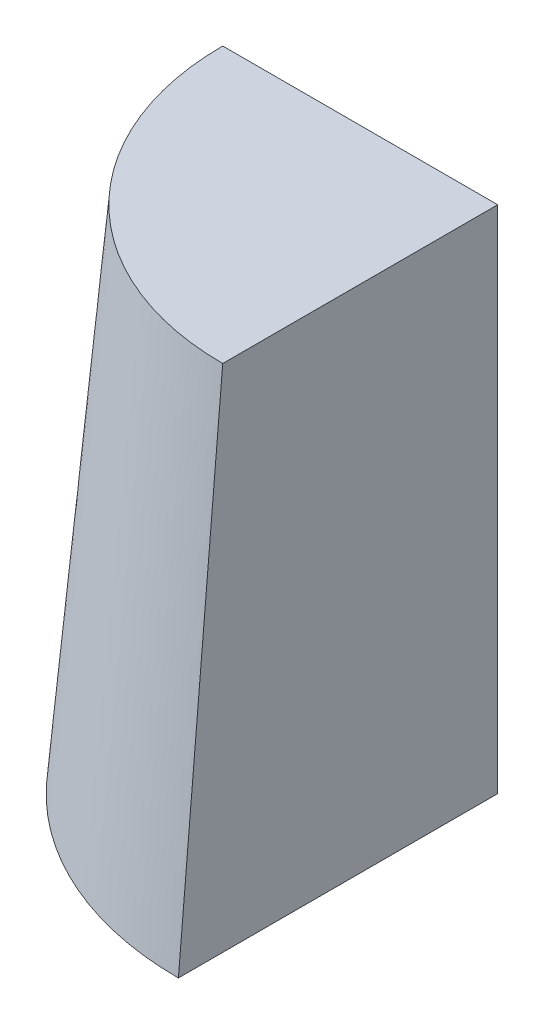
ISO-10303-21;
HEADER;
FILE_DESCRIPTION(('STEP AP214'),'2;1');
FILE_NAME('part.step','',(''),(''),'','','');
FILE_SCHEMA(('AUTOMOTIVE_DESIGN { 1 0 10303 214 1 1 1 1 }'));
ENDSEC;
DATA;
#1=APPLICATION_CONTEXT('core data for automotive mechanical design processes');
#2=APPLICATION_PROTOCOL_DEFINITION('international standard','automotive_design',2000,#1);
#3=PRODUCT_CONTEXT('',#1,'mechanical');
#4=PRODUCT('Part','Part','',(#3));
#5=PRODUCT_RELATED_PRODUCT_CATEGORY('part','',(#4));
#6=PRODUCT_DEFINITION_FORMATION('','',#4);
#7=PRODUCT_DEFINITION_CONTEXT('part definition',#1,'design');
#8=PRODUCT_DEFINITION('design','',#6,#7);
#9=PRODUCT_DEFINITION_SHAPE('','',#8);
#10=(LENGTH_UNIT() NAMED_UNIT(*) SI_UNIT(.MILLI.,.METRE.));
#11=(NAMED_UNIT(*) PLANE_ANGLE_UNIT() SI_UNIT($,.RADIAN.));
#12=(NAMED_UNIT(*) SI_UNIT($,.STERADIAN.) SOLID_ANGLE_UNIT());
#13=UNCERTAINTY_MEASURE_WITH_UNIT(LENGTH_MEASURE(1.E-05),#10,'distance_accuracy_value','');
#14=(GEOMETRIC_REPRESENTATION_CONTEXT(3) GLOBAL_UNCERTAINTY_ASSIGNED_CONTEXT((#13)) GLOBAL_UNIT_ASSIGNED_CONTEXT((#10,
#11,#12)) REPRESENTATION_CONTEXT('',''));
#15=CARTESIAN_POINT('',(0.,0.,0.));
#16=DIRECTION('',(0.,0.,1.));
#17=DIRECTION('',(1.,0.,0.));
#18=AXIS2_PLACEMENT_3D('',#15,#16,#17);
#19=CARTESIAN_POINT('',(0.,0.,0.));
#20=DIRECTION('',(0.,1.,0.));
#21=DIRECTION('',(0.,0.,1.));
#22=AXIS2_PLACEMENT_3D('',#19,#20,#21);
#23=PLANE('',#22);
#24=DIRECTION('',(-1.,0.,0.));
#25=VECTOR('',#24,1.);
#26=CARTESIAN_POINT('',(0.,0.,0.));
#27=LINE('',#26,#25);
#28=CARTESIAN_POINT('',(0.,0.,0.));
#29=VERTEX_POINT('',#28);
#30=CARTESIAN_POINT('',(-72.,0.,0.));
#31=VERTEX_POINT('',#30);
#32=EDGE_CURVE('E152',#29,#31,#27,.T.);
#33=ORIENTED_EDGE('',*,*,#32,.F.);
#34=DIRECTION('',(0.,0.,-1.));
#35=VECTOR('',#34,1.);
#36=CARTESIAN_POINT('',(0.,0.,0.));
#37=LINE('',#36,#35);
#38=CARTESIAN_POINT('',(0.,0.,72.));
#39=VERTEX_POINT('',#38);
#40=EDGE_CURVE('E13',#39,#29,#37,.T.);
#41=ORIENTED_EDGE('',*,*,#40,.F.);
#42=CARTESIAN_POINT('',(0.,0.,0.));
#43=DIRECTION('',(0.,1.,0.));
#44=DIRECTION('',(0.,0.,1.));
#45=AXIS2_PLACEMENT_3D('',#42,#43,#44);
#46=CIRCLE('',#45,72.);
#47=EDGE_CURVE('E97',#31,#39,#46,.T.);
#48=ORIENTED_EDGE('',*,*,#47,.F.);
#49=EDGE_LOOP('',(#33,#41,#48));
#50=FACE_BOUND('',#49,.T.);
#51=ADVANCED_FACE('F85',(#50),#23,.F.);
#52=CARTESIAN_POINT('',(0.,115.,0.));
#53=DIRECTION('',(0.,1.,0.));
#54=DIRECTION('',(0.,0.,1.));
#55=AXIS2_PLACEMENT_3D('',#52,#53,#54);
#56=PLANE('',#55);
#57=DIRECTION('',(-1.,0.,0.));
#58=VECTOR('',#57,1.);
#59=CARTESIAN_POINT('',(-62.,115.,0.));
#60=LINE('',#59,#58);
#61=CARTESIAN_POINT('',(0.,115.,0.));
#62=VERTEX_POINT('',#61);
#63=CARTESIAN_POINT('',(-62.,115.,0.));
#64=VERTEX_POINT('',#63);
#65=EDGE_CURVE('E127',#62,#64,#60,.T.);
#66=ORIENTED_EDGE('',*,*,#65,.T.);
#67=CARTESIAN_POINT('',(0.,115.,0.));
#68=DIRECTION('',(0.,1.,0.));
#69=DIRECTION('',(0.,0.,1.));
#70=AXIS2_PLACEMENT_3D('',#67,#68,#69);
#71=CIRCLE('',#70,62.);
#72=CARTESIAN_POINT('',(0.,115.,62.));
#73=VERTEX_POINT('',#72);
#74=EDGE_CURVE('E130',#64,#73,#71,.T.);
#75=ORIENTED_EDGE('',*,*,#74,.T.);
#76=DIRECTION('',(0.,0.,-1.));
#77=VECTOR('',#76,1.);
#78=CARTESIAN_POINT('',(0.,115.,0.));
#79=LINE('',#78,#77);
#80=EDGE_CURVE('E123',#73,#62,#79,.T.);
#81=ORIENTED_EDGE('',*,*,#80,.T.);
#82=EDGE_LOOP('',(#66,#75,#81));
#83=FACE_BOUND('',#82,.T.);
#84=ADVANCED_FACE('F126',(#83),#56,.T.);
#85=CARTESIAN_POINT('',(-62.,115.,0.));
#86=DIRECTION('',(0.,0.,-1.));
#87=DIRECTION('',(1.,0.,0.));
#88=AXIS2_PLACEMENT_3D('',#85,#86,#87);
#89=PLANE('',#88);
#90=ORIENTED_EDGE('',*,*,#65,.F.);
#91=CARTESIAN_POINT('',(0.,115.,0.));
#92=CARTESIAN_POINT('',(0.,76.6666666666667,0.));
#93=CARTESIAN_POINT('',(0.,38.3333333333333,0.));
#94=CARTESIAN_POINT('',(0.,0.,0.));
#95=B_SPLINE_CURVE_WITH_KNOTS('',3,(#91,#92,#93,#94),.UNSPECIFIED.,.F.,.F.,(4,4),(0.,1.),.UNSPECIFIED.);
#96=EDGE_CURVE('E144',#62,#29,#95,.T.);
#97=ORIENTED_EDGE('',*,*,#96,.T.);
#98=ORIENTED_EDGE('',*,*,#32,.T.);
#99=CARTESIAN_POINT('',(-62.,115.,0.));
#100=CARTESIAN_POINT('',(-65.3333333333333,76.6666666666667,0.));
#101=CARTESIAN_POINT('',(-68.6666666666667,38.3333333333333,0.));
#102=CARTESIAN_POINT('',(-72.,0.,0.));
#103=B_SPLINE_CURVE_WITH_KNOTS('',3,(#99,#100,#101,#102),.UNSPECIFIED.,.F.,.F.,(4,4),(0.,1.),.UNSPECIFIED.);
#104=EDGE_CURVE('E146',#64,#31,#103,.T.);
#105=ORIENTED_EDGE('',*,*,#104,.F.);
#106=EDGE_LOOP('',(#90,#97,#98,#105));
#107=FACE_BOUND('',#106,.T.);
#108=ADVANCED_FACE('F143',(#107),#89,.T.);
#109=CARTESIAN_POINT('',(0.,115.,62.));
#110=CARTESIAN_POINT('',(0.,76.6666666666667,65.3333333333333));
#111=CARTESIAN_POINT('',(0.,38.3333333333333,68.6666666666667));
#112=CARTESIAN_POINT('',(0.,0.,72.));
#113=CARTESIAN_POINT('',(-4.05789048448369,115.,62.));
#114=CARTESIAN_POINT('',(-4.27605663956345,76.6666666666667,65.3333333333333));
#115=CARTESIAN_POINT('',(-4.49422279464322,38.3333333333333,68.6666666666667));
#116=CARTESIAN_POINT('',(-4.71238894972299,0.,72.));
#117=CARTESIAN_POINT('',(-12.1735745336793,115.,61.2009042789177));
#118=CARTESIAN_POINT('',(-12.8280677881782,76.6666666666667,64.491275476709));
#119=CARTESIAN_POINT('',(-13.4825610426771,38.3333333333333,67.7816466745003));
#120=CARTESIAN_POINT('',(-14.1370542971759,0.,71.0720178722916));
#121=CARTESIAN_POINT('',(-23.879370606325,115.,57.6498417501721));
#122=CARTESIAN_POINT('',(-25.1632077356973,76.6666666666667,60.7492956077082));
#123=CARTESIAN_POINT('',(-26.4470448650696,38.3333333333334,63.8487494652443));
#124=CARTESIAN_POINT('',(-27.7308819944419,0.,66.9482033227805));
#125=CARTESIAN_POINT('',(-34.6674688825507,115.,51.8835602818635));
#126=CARTESIAN_POINT('',(-36.531311295591,76.6666666666665,54.6729990066949));
#127=CARTESIAN_POINT('',(-38.3951537086314,38.3333333333332,57.4624377315263));
#128=CARTESIAN_POINT('',(-40.2589961216717,0.,60.2518764563578));
#129=CARTESIAN_POINT('',(-44.1233055659822,115.,44.1233055659822));
#130=CARTESIAN_POINT('',(-46.4955262953361,76.6666666666669,46.4955262953361));
#131=CARTESIAN_POINT('',(-48.86774702469,38.3333333333334,48.8677470246899));
#132=CARTESIAN_POINT('',(-51.239967754044,0.,51.2399677540437));
#133=CARTESIAN_POINT('',(-51.8835602818635,115.,34.6674688825506));
#134=CARTESIAN_POINT('',(-54.6729990066949,76.6666666666665,36.5313112955911));
#135=CARTESIAN_POINT('',(-57.4624377315263,38.3333333333333,38.3951537086315));
#136=CARTESIAN_POINT('',(-60.2518764563577,0.,40.2589961216719));
#137=CARTESIAN_POINT('',(-57.6498417501722,115.,23.879370606325));
#138=CARTESIAN_POINT('',(-60.7492956077083,76.6666666666668,25.1632077356973));
#139=CARTESIAN_POINT('',(-63.8487494652445,38.3333333333334,26.4470448650696));
#140=CARTESIAN_POINT('',(-66.9482033227806,0.,27.7308819944419));
#141=CARTESIAN_POINT('',(-61.2009042789176,115.,12.1735745336792));
#142=CARTESIAN_POINT('',(-64.4912754767089,76.6666666666665,12.8280677881782));
#143=CARTESIAN_POINT('',(-67.7816466745001,38.3333333333333,13.4825610426771));
#144=CARTESIAN_POINT('',(-71.0720178722914,0.,14.137054297176));
#145=CARTESIAN_POINT('',(-62.,115.,4.05789048448367));
#146=CARTESIAN_POINT('',(-65.3333333333333,76.6666666666667,4.27605663956344));
#147=CARTESIAN_POINT('',(-68.6666666666667,38.3333333333333,4.49422279464321));
#148=CARTESIAN_POINT('',(-72.,0.,4.71238894972298));
#149=CARTESIAN_POINT('',(-62.,115.,0.));
#150=CARTESIAN_POINT('',(-65.3333333333333,76.6666666666667,0.));
#151=CARTESIAN_POINT('',(-68.6666666666667,38.3333333333333,0.));
#152=CARTESIAN_POINT('',(-72.,0.,0.));
#153=B_SPLINE_SURFACE_WITH_KNOTS('',3,3,((#109,#110,#111,#112),(#113,#114,#115,#116),(#117,#118,
#119,#120),(#121,#122,#123,#124),(#125,#126,#127,#128),(#129,#130,#131,#132),(#133,#134,#135,
#136),(#137,#138,#139,#140),(#141,#142,#143,#144),(#145,#146,#147,#148),(#149,#150,#151,#152)),
.UNSPECIFIED.,.F.,.F.,.F.,(4,1,1,1,1,1,1,1,4),(4,4),(0.280049576755779,0.335037182566834,
0.390024788377889,0.445012394188945,0.5,0.554987605811055,0.609975211622111,0.664962817433166,
0.719950423244221),(0.,1.),.UNSPECIFIED.);
#154=CARTESIAN_POINT('',(0.,115.,62.));
#155=CARTESIAN_POINT('',(0.,76.6666666666667,65.3333333333333));
#156=CARTESIAN_POINT('',(0.,38.3333333333333,68.6666666666667));
#157=CARTESIAN_POINT('',(0.,0.,72.));
#158=B_SPLINE_CURVE_WITH_KNOTS('',3,(#154,#155,#156,#157),.UNSPECIFIED.,.F.,.F.,(4,4),(0.,1.),.UNSPECIFIED.);
#159=EDGE_CURVE('E157',#73,#39,#158,.T.);
#160=ORIENTED_EDGE('',*,*,#74,.F.);
#161=ORIENTED_EDGE('',*,*,#104,.T.);
#162=ORIENTED_EDGE('',*,*,#47,.T.);
#163=ORIENTED_EDGE('',*,*,#159,.F.);
#164=EDGE_LOOP('',(#160,#161,#162,#163));
#165=FACE_BOUND('',#164,.T.);
#166=ADVANCED_FACE('F178',(#165),#153,.T.);
#167=CARTESIAN_POINT('',(0.,115.,0.));
#168=DIRECTION('',(1.,0.,0.));
#169=DIRECTION('',(0.,0.,1.));
#170=AXIS2_PLACEMENT_3D('',#167,#168,#169);
#171=PLANE('',#170);
#172=ORIENTED_EDGE('',*,*,#80,.F.);
#173=ORIENTED_EDGE('',*,*,#159,.T.);
#174=ORIENTED_EDGE('',*,*,#40,.T.);
#175=ORIENTED_EDGE('',*,*,#96,.F.);
#176=EDGE_LOOP('',(#172,#173,#174,#175));
#177=FACE_BOUND('',#176,.T.);
#178=ADVANCED_FACE('F87',(#177),#171,.T.);
#179=CLOSED_SHELL('',(#51,#84,#108,#166,#178));
#180=MANIFOLD_SOLID_BREP('B2',#179);
#181=ADVANCED_BREP_SHAPE_REPRESENTATION('',(#18,#180),#14);
#182=SHAPE_DEFINITION_REPRESENTATION(#9,#181);
ENDSEC;
END-ISO-10303-21;
